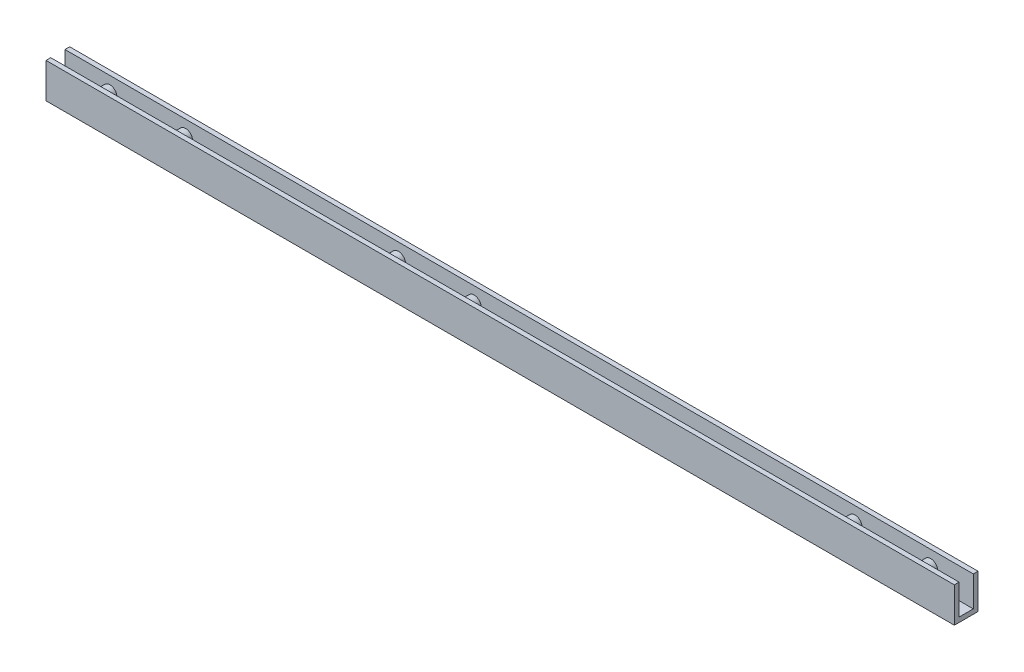
ISO-10303-21;
HEADER;
FILE_DESCRIPTION(('STEP AP214'),'2;1');
FILE_NAME('part.step','',(''),(''),'','','');
FILE_SCHEMA(('AUTOMOTIVE_DESIGN { 1 0 10303 214 1 1 1 1 }'));
ENDSEC;
DATA;
#1=APPLICATION_CONTEXT('core data for automotive mechanical design processes');
#2=APPLICATION_PROTOCOL_DEFINITION('international standard','automotive_design',2000,#1);
#3=PRODUCT_CONTEXT('',#1,'mechanical');
#4=PRODUCT('Part','Part','',(#3));
#5=PRODUCT_RELATED_PRODUCT_CATEGORY('part','',(#4));
#6=PRODUCT_DEFINITION_FORMATION('','',#4);
#7=PRODUCT_DEFINITION_CONTEXT('part definition',#1,'design');
#8=PRODUCT_DEFINITION('design','',#6,#7);
#9=PRODUCT_DEFINITION_SHAPE('','',#8);
#10=(LENGTH_UNIT() NAMED_UNIT(*) SI_UNIT(.MILLI.,.METRE.));
#11=(NAMED_UNIT(*) PLANE_ANGLE_UNIT() SI_UNIT($,.RADIAN.));
#12=(NAMED_UNIT(*) SI_UNIT($,.STERADIAN.) SOLID_ANGLE_UNIT());
#13=UNCERTAINTY_MEASURE_WITH_UNIT(LENGTH_MEASURE(1.E-05),#10,'distance_accuracy_value','');
#14=(GEOMETRIC_REPRESENTATION_CONTEXT(3) GLOBAL_UNCERTAINTY_ASSIGNED_CONTEXT((#13)) GLOBAL_UNIT_ASSIGNED_CONTEXT((#10,
#11,#12)) REPRESENTATION_CONTEXT('',''));
#15=CARTESIAN_POINT('',(0.,0.,0.));
#16=DIRECTION('',(0.,0.,1.));
#17=DIRECTION('',(1.,0.,0.));
#18=AXIS2_PLACEMENT_3D('',#15,#16,#17);
#19=CARTESIAN_POINT('',(609.6,-11.7475,7.9375));
#20=DIRECTION('',(0.,0.,-1.));
#21=DIRECTION('',(0.,1.,0.));
#22=AXIS2_PLACEMENT_3D('',#19,#20,#21);
#23=PLANE('',#22);
#24=DIRECTION('',(0.,-1.,0.));
#25=VECTOR('',#24,1.);
#26=CARTESIAN_POINT('',(0.,-11.7475,7.9375));
#27=LINE('',#26,#25);
#28=CARTESIAN_POINT('',(0.,11.7475,7.9375));
#29=VERTEX_POINT('',#28);
#30=CARTESIAN_POINT('',(0.,-11.7475,7.9375));
#31=VERTEX_POINT('',#30);
#32=EDGE_CURVE('E130',#29,#31,#27,.T.);
#33=ORIENTED_EDGE('',*,*,#32,.T.);
#34=DIRECTION('',(-1.,0.,0.));
#35=VECTOR('',#34,1.);
#36=CARTESIAN_POINT('',(609.6,-11.7475,7.9375));
#37=LINE('',#36,#35);
#38=CARTESIAN_POINT('',(609.6,-11.7475,7.9375));
#39=VERTEX_POINT('',#38);
#40=EDGE_CURVE('E11',#39,#31,#37,.T.);
#41=ORIENTED_EDGE('',*,*,#40,.F.);
#42=DIRECTION('',(0.,-1.,0.));
#43=VECTOR('',#42,1.);
#44=CARTESIAN_POINT('',(609.6,-11.7475,7.9375));
#45=LINE('',#44,#43);
#46=CARTESIAN_POINT('',(609.6,11.7475,7.9375));
#47=VERTEX_POINT('',#46);
#48=EDGE_CURVE('E146',#47,#39,#45,.T.);
#49=ORIENTED_EDGE('',*,*,#48,.F.);
#50=DIRECTION('',(-1.,0.,0.));
#51=VECTOR('',#50,1.);
#52=CARTESIAN_POINT('',(609.6,11.7475,7.9375));
#53=LINE('',#52,#51);
#54=EDGE_CURVE('E126',#47,#29,#53,.T.);
#55=ORIENTED_EDGE('',*,*,#54,.T.);
#56=EDGE_LOOP('',(#33,#41,#49,#55));
#57=FACE_BOUND('',#56,.T.);
#58=ADVANCED_FACE('F34',(#57),#23,.F.);
#59=CARTESIAN_POINT('',(609.6,-11.7475,-7.9375));
#60=DIRECTION('',(0.,1.,0.));
#61=DIRECTION('',(0.,0.,1.));
#62=AXIS2_PLACEMENT_3D('',#59,#60,#61);
#63=PLANE('',#62);
#64=DIRECTION('',(0.,0.,-1.));
#65=VECTOR('',#64,1.);
#66=CARTESIAN_POINT('',(0.,-11.7475,-7.9375));
#67=LINE('',#66,#65);
#68=CARTESIAN_POINT('',(0.,-11.7475,-7.9375));
#69=VERTEX_POINT('',#68);
#70=EDGE_CURVE('E133',#31,#69,#67,.T.);
#71=ORIENTED_EDGE('',*,*,#70,.T.);
#72=DIRECTION('',(-1.,0.,0.));
#73=VECTOR('',#72,1.);
#74=CARTESIAN_POINT('',(609.6,-11.7475,-7.9375));
#75=LINE('',#74,#73);
#76=CARTESIAN_POINT('',(609.6,-11.7475,-7.9375));
#77=VERTEX_POINT('',#76);
#78=EDGE_CURVE('E42',#77,#69,#75,.T.);
#79=ORIENTED_EDGE('',*,*,#78,.F.);
#80=DIRECTION('',(0.,0.,-1.));
#81=VECTOR('',#80,1.);
#82=CARTESIAN_POINT('',(609.6,-11.7475,-7.9375));
#83=LINE('',#82,#81);
#84=EDGE_CURVE('E92',#39,#77,#83,.T.);
#85=ORIENTED_EDGE('',*,*,#84,.F.);
#86=ORIENTED_EDGE('',*,*,#40,.T.);
#87=EDGE_LOOP('',(#71,#79,#85,#86));
#88=FACE_BOUND('',#87,.T.);
#89=ADVANCED_FACE('F252',(#88),#63,.F.);
#90=CARTESIAN_POINT('',(609.6,-11.7475,-7.9375));
#91=DIRECTION('',(0.,0.,1.));
#92=DIRECTION('',(1.,0.,0.));
#93=AXIS2_PLACEMENT_3D('',#90,#91,#92);
#94=PLANE('',#93);
#95=DIRECTION('',(0.,1.,0.));
#96=VECTOR('',#95,1.);
#97=CARTESIAN_POINT('',(0.,-11.7475,-7.9375));
#98=LINE('',#97,#96);
#99=CARTESIAN_POINT('',(0.,11.7475,-7.9375));
#100=VERTEX_POINT('',#99);
#101=EDGE_CURVE('E136',#69,#100,#98,.T.);
#102=ORIENTED_EDGE('',*,*,#101,.T.);
#103=DIRECTION('',(-1.,0.,0.));
#104=VECTOR('',#103,1.);
#105=CARTESIAN_POINT('',(609.6,11.7475,-7.9375));
#106=LINE('',#105,#104);
#107=CARTESIAN_POINT('',(609.6,11.7475,-7.9375));
#108=VERTEX_POINT('',#107);
#109=EDGE_CURVE('E153',#108,#100,#106,.T.);
#110=ORIENTED_EDGE('',*,*,#109,.F.);
#111=DIRECTION('',(0.,1.,0.));
#112=VECTOR('',#111,1.);
#113=CARTESIAN_POINT('',(609.6,-11.7475,-7.9375));
#114=LINE('',#113,#112);
#115=EDGE_CURVE('E161',#77,#108,#114,.T.);
#116=ORIENTED_EDGE('',*,*,#115,.F.);
#117=ORIENTED_EDGE('',*,*,#78,.T.);
#118=EDGE_LOOP('',(#102,#110,#116,#117));
#119=FACE_BOUND('',#118,.T.);
#120=ADVANCED_FACE('F159',(#119),#94,.F.);
#121=CARTESIAN_POINT('',(609.6,11.7475,-4.7625));
#122=DIRECTION('',(0.,-1.,0.));
#123=DIRECTION('',(0.,0.,-1.));
#124=AXIS2_PLACEMENT_3D('',#121,#122,#123);
#125=PLANE('',#124);
#126=DIRECTION('',(0.,0.,1.));
#127=VECTOR('',#126,1.);
#128=CARTESIAN_POINT('',(0.,11.7475,-4.7625));
#129=LINE('',#128,#127);
#130=CARTESIAN_POINT('',(0.,11.7475,-4.7625));
#131=VERTEX_POINT('',#130);
#132=EDGE_CURVE('E138',#100,#131,#129,.T.);
#133=ORIENTED_EDGE('',*,*,#132,.T.);
#134=DIRECTION('',(-1.,0.,0.));
#135=VECTOR('',#134,1.);
#136=CARTESIAN_POINT('',(609.6,11.7475,-4.7625));
#137=LINE('',#136,#135);
#138=CARTESIAN_POINT('',(609.6,11.7475,-4.7625));
#139=VERTEX_POINT('',#138);
#140=EDGE_CURVE('E150',#139,#131,#137,.T.);
#141=ORIENTED_EDGE('',*,*,#140,.F.);
#142=DIRECTION('',(0.,0.,1.));
#143=VECTOR('',#142,1.);
#144=CARTESIAN_POINT('',(609.6,11.7475,-4.7625));
#145=LINE('',#144,#143);
#146=EDGE_CURVE('E172',#108,#139,#145,.T.);
#147=ORIENTED_EDGE('',*,*,#146,.F.);
#148=ORIENTED_EDGE('',*,*,#109,.T.);
#149=EDGE_LOOP('',(#133,#141,#147,#148));
#150=FACE_BOUND('',#149,.T.);
#151=ADVANCED_FACE('F168',(#150),#125,.F.);
#152=CARTESIAN_POINT('',(609.6,-8.5725,-4.7625));
#153=DIRECTION('',(0.,0.,-1.));
#154=DIRECTION('',(-1.,0.,0.));
#155=AXIS2_PLACEMENT_3D('',#152,#153,#154);
#156=PLANE('',#155);
#157=CARTESIAN_POINT('',(80.9625,1.5875,-4.7625));
#158=DIRECTION('',(0.,0.,-1.));
#159=DIRECTION('',(-1.,0.,0.));
#160=AXIS2_PLACEMENT_3D('',#157,#158,#159);
#161=CIRCLE('',#160,4.7625);
#162=CARTESIAN_POINT('',(76.2,1.5875,-4.7625));
#163=VERTEX_POINT('',#162);
#164=EDGE_CURVE('E207',#163,#163,#161,.F.);
#165=ORIENTED_EDGE('',*,*,#164,.F.);
#166=EDGE_LOOP('',(#165));
#167=FACE_BOUND('',#166,.T.);
#168=CARTESIAN_POINT('',(30.1625,1.5875,-4.7625));
#169=DIRECTION('',(0.,0.,-1.));
#170=DIRECTION('',(-1.,0.,0.));
#171=AXIS2_PLACEMENT_3D('',#168,#169,#170);
#172=CIRCLE('',#171,4.76250000000001);
#173=CARTESIAN_POINT('',(25.4,1.5875,-4.7625));
#174=VERTEX_POINT('',#173);
#175=EDGE_CURVE('E201',#174,#174,#172,.F.);
#176=ORIENTED_EDGE('',*,*,#175,.F.);
#177=EDGE_LOOP('',(#176));
#178=FACE_BOUND('',#177,.T.);
#179=CARTESIAN_POINT('',(223.8375,1.5875,-4.7625));
#180=DIRECTION('',(0.,0.,-1.));
#181=DIRECTION('',(-1.,0.,0.));
#182=AXIS2_PLACEMENT_3D('',#179,#180,#181);
#183=CIRCLE('',#182,4.76250000000001);
#184=CARTESIAN_POINT('',(219.075,1.5875,-4.7625));
#185=VERTEX_POINT('',#184);
#186=EDGE_CURVE('E195',#185,#185,#183,.F.);
#187=ORIENTED_EDGE('',*,*,#186,.F.);
#188=EDGE_LOOP('',(#187));
#189=FACE_BOUND('',#188,.T.);
#190=CARTESIAN_POINT('',(274.6375,1.5875,-4.7625));
#191=DIRECTION('',(0.,0.,-1.));
#192=DIRECTION('',(-1.,0.,0.));
#193=AXIS2_PLACEMENT_3D('',#190,#191,#192);
#194=CIRCLE('',#193,4.76250000000007);
#195=CARTESIAN_POINT('',(269.875,1.5875,-4.7625));
#196=VERTEX_POINT('',#195);
#197=EDGE_CURVE('E189',#196,#196,#194,.F.);
#198=ORIENTED_EDGE('',*,*,#197,.F.);
#199=EDGE_LOOP('',(#198));
#200=FACE_BOUND('',#199,.T.);
#201=CARTESIAN_POINT('',(530.225,1.5875,-4.7625));
#202=DIRECTION('',(0.,0.,-1.));
#203=DIRECTION('',(-1.,0.,0.));
#204=AXIS2_PLACEMENT_3D('',#201,#202,#203);
#205=CIRCLE('',#204,4.76250000000001);
#206=CARTESIAN_POINT('',(525.4625,1.5875,-4.7625));
#207=VERTEX_POINT('',#206);
#208=EDGE_CURVE('E183',#207,#207,#205,.F.);
#209=ORIENTED_EDGE('',*,*,#208,.F.);
#210=EDGE_LOOP('',(#209));
#211=FACE_BOUND('',#210,.T.);
#212=CARTESIAN_POINT('',(581.025,1.5875,-4.7625));
#213=DIRECTION('',(0.,0.,-1.));
#214=DIRECTION('',(-1.,0.,0.));
#215=AXIS2_PLACEMENT_3D('',#212,#213,#214);
#216=CIRCLE('',#215,4.76250000000001);
#217=CARTESIAN_POINT('',(576.2625,1.5875,-4.7625));
#218=VERTEX_POINT('',#217);
#219=EDGE_CURVE('E134',#218,#218,#216,.F.);
#220=ORIENTED_EDGE('',*,*,#219,.F.);
#221=EDGE_LOOP('',(#220));
#222=FACE_BOUND('',#221,.T.);
#223=DIRECTION('',(0.,-1.,0.));
#224=VECTOR('',#223,1.);
#225=CARTESIAN_POINT('',(0.,-8.5725,-4.7625));
#226=LINE('',#225,#224);
#227=CARTESIAN_POINT('',(0.,-8.5725,-4.7625));
#228=VERTEX_POINT('',#227);
#229=EDGE_CURVE('E141',#131,#228,#226,.T.);
#230=ORIENTED_EDGE('',*,*,#229,.T.);
#231=DIRECTION('',(-1.,0.,0.));
#232=VECTOR('',#231,1.);
#233=CARTESIAN_POINT('',(609.6,-8.5725,-4.7625));
#234=LINE('',#233,#232);
#235=CARTESIAN_POINT('',(609.6,-8.5725,-4.7625));
#236=VERTEX_POINT('',#235);
#237=EDGE_CURVE('E121',#236,#228,#234,.T.);
#238=ORIENTED_EDGE('',*,*,#237,.F.);
#239=DIRECTION('',(0.,-1.,0.));
#240=VECTOR('',#239,1.);
#241=CARTESIAN_POINT('',(609.6,8.5725,-4.7625));
#242=LINE('',#241,#240);
#243=EDGE_CURVE('E111',#139,#236,#242,.T.);
#244=ORIENTED_EDGE('',*,*,#243,.F.);
#245=ORIENTED_EDGE('',*,*,#140,.T.);
#246=EDGE_LOOP('',(#230,#238,#244,#245));
#247=FACE_BOUND('',#246,.T.);
#248=ADVANCED_FACE('F171',(#167,#178,#189,#200,#211,#222,#247),#156,.F.);
#249=CARTESIAN_POINT('',(609.6,-8.5725,-4.7625));
#250=DIRECTION('',(0.,-1.,0.));
#251=DIRECTION('',(0.,0.,-1.));
#252=AXIS2_PLACEMENT_3D('',#249,#250,#251);
#253=PLANE('',#252);
#254=DIRECTION('',(0.,0.,1.));
#255=VECTOR('',#254,1.);
#256=CARTESIAN_POINT('',(0.,-8.5725,-4.7625));
#257=LINE('',#256,#255);
#258=CARTESIAN_POINT('',(0.,-8.5725,4.7625));
#259=VERTEX_POINT('',#258);
#260=EDGE_CURVE('E120',#228,#259,#257,.T.);
#261=ORIENTED_EDGE('',*,*,#260,.T.);
#262=DIRECTION('',(-1.,0.,0.));
#263=VECTOR('',#262,1.);
#264=CARTESIAN_POINT('',(609.6,-8.5725,4.7625));
#265=LINE('',#264,#263);
#266=CARTESIAN_POINT('',(609.6,-8.5725,4.7625));
#267=VERTEX_POINT('',#266);
#268=EDGE_CURVE('E117',#267,#259,#265,.T.);
#269=ORIENTED_EDGE('',*,*,#268,.F.);
#270=DIRECTION('',(0.,0.,1.));
#271=VECTOR('',#270,1.);
#272=CARTESIAN_POINT('',(609.6,-8.5725,-4.7625));
#273=LINE('',#272,#271);
#274=EDGE_CURVE('E105',#236,#267,#273,.T.);
#275=ORIENTED_EDGE('',*,*,#274,.F.);
#276=ORIENTED_EDGE('',*,*,#237,.T.);
#277=EDGE_LOOP('',(#261,#269,#275,#276));
#278=FACE_BOUND('',#277,.T.);
#279=ADVANCED_FACE('F118',(#278),#253,.F.);
#280=CARTESIAN_POINT('',(609.6,7.04849999999999,4.7625));
#281=DIRECTION('',(0.,0.,1.));
#282=DIRECTION('',(1.,0.,0.));
#283=AXIS2_PLACEMENT_3D('',#280,#281,#282);
#284=PLANE('',#283);
#285=CARTESIAN_POINT('',(80.9625,1.5875,4.7625));
#286=DIRECTION('',(0.,0.,1.));
#287=DIRECTION('',(1.,0.,0.));
#288=AXIS2_PLACEMENT_3D('',#285,#286,#287);
#289=CIRCLE('',#288,4.7625);
#290=CARTESIAN_POINT('',(85.725,1.5875,4.7625));
#291=VERTEX_POINT('',#290);
#292=EDGE_CURVE('E210',#291,#291,#289,.T.);
#293=ORIENTED_EDGE('',*,*,#292,.T.);
#294=EDGE_LOOP('',(#293));
#295=FACE_BOUND('',#294,.T.);
#296=CARTESIAN_POINT('',(30.1625,1.5875,4.7625));
#297=DIRECTION('',(0.,0.,1.));
#298=DIRECTION('',(1.,0.,0.));
#299=AXIS2_PLACEMENT_3D('',#296,#297,#298);
#300=CIRCLE('',#299,4.76250000000001);
#301=CARTESIAN_POINT('',(34.925,1.5875,4.7625));
#302=VERTEX_POINT('',#301);
#303=EDGE_CURVE('E204',#302,#302,#300,.T.);
#304=ORIENTED_EDGE('',*,*,#303,.T.);
#305=EDGE_LOOP('',(#304));
#306=FACE_BOUND('',#305,.T.);
#307=CARTESIAN_POINT('',(223.8375,1.5875,4.7625));
#308=DIRECTION('',(0.,0.,1.));
#309=DIRECTION('',(1.,0.,0.));
#310=AXIS2_PLACEMENT_3D('',#307,#308,#309);
#311=CIRCLE('',#310,4.76250000000001);
#312=CARTESIAN_POINT('',(228.6,1.5875,4.7625));
#313=VERTEX_POINT('',#312);
#314=EDGE_CURVE('E198',#313,#313,#311,.T.);
#315=ORIENTED_EDGE('',*,*,#314,.T.);
#316=EDGE_LOOP('',(#315));
#317=FACE_BOUND('',#316,.T.);
#318=CARTESIAN_POINT('',(274.6375,1.5875,4.7625));
#319=DIRECTION('',(0.,0.,1.));
#320=DIRECTION('',(1.,0.,0.));
#321=AXIS2_PLACEMENT_3D('',#318,#319,#320);
#322=CIRCLE('',#321,4.76250000000007);
#323=CARTESIAN_POINT('',(279.4,1.5875,4.7625));
#324=VERTEX_POINT('',#323);
#325=EDGE_CURVE('E192',#324,#324,#322,.T.);
#326=ORIENTED_EDGE('',*,*,#325,.T.);
#327=EDGE_LOOP('',(#326));
#328=FACE_BOUND('',#327,.T.);
#329=CARTESIAN_POINT('',(530.225,1.5875,4.7625));
#330=DIRECTION('',(0.,0.,1.));
#331=DIRECTION('',(1.,0.,0.));
#332=AXIS2_PLACEMENT_3D('',#329,#330,#331);
#333=CIRCLE('',#332,4.76250000000001);
#334=CARTESIAN_POINT('',(534.9875,1.5875,4.7625));
#335=VERTEX_POINT('',#334);
#336=EDGE_CURVE('E186',#335,#335,#333,.T.);
#337=ORIENTED_EDGE('',*,*,#336,.T.);
#338=EDGE_LOOP('',(#337));
#339=FACE_BOUND('',#338,.T.);
#340=CARTESIAN_POINT('',(581.025,1.5875,4.7625));
#341=DIRECTION('',(0.,0.,1.));
#342=DIRECTION('',(1.,0.,0.));
#343=AXIS2_PLACEMENT_3D('',#340,#341,#342);
#344=CIRCLE('',#343,4.76250000000001);
#345=CARTESIAN_POINT('',(585.7875,1.5875,4.7625));
#346=VERTEX_POINT('',#345);
#347=EDGE_CURVE('E180',#346,#346,#344,.T.);
#348=ORIENTED_EDGE('',*,*,#347,.T.);
#349=EDGE_LOOP('',(#348));
#350=FACE_BOUND('',#349,.T.);
#351=DIRECTION('',(0.,1.,0.));
#352=VECTOR('',#351,1.);
#353=CARTESIAN_POINT('',(0.,7.04849999999999,4.7625));
#354=LINE('',#353,#352);
#355=CARTESIAN_POINT('',(0.,11.7475,4.7625));
#356=VERTEX_POINT('',#355);
#357=EDGE_CURVE('E78',#259,#356,#354,.T.);
#358=ORIENTED_EDGE('',*,*,#357,.T.);
#359=DIRECTION('',(-1.,0.,0.));
#360=VECTOR('',#359,1.);
#361=CARTESIAN_POINT('',(609.6,11.7475,4.7625));
#362=LINE('',#361,#360);
#363=CARTESIAN_POINT('',(609.6,11.7475,4.7625));
#364=VERTEX_POINT('',#363);
#365=EDGE_CURVE('E122',#364,#356,#362,.T.);
#366=ORIENTED_EDGE('',*,*,#365,.F.);
#367=DIRECTION('',(0.,1.,0.));
#368=VECTOR('',#367,1.);
#369=CARTESIAN_POINT('',(609.6,-8.5725,4.7625));
#370=LINE('',#369,#368);
#371=EDGE_CURVE('E109',#267,#364,#370,.T.);
#372=ORIENTED_EDGE('',*,*,#371,.F.);
#373=ORIENTED_EDGE('',*,*,#268,.T.);
#374=EDGE_LOOP('',(#358,#366,#372,#373));
#375=FACE_BOUND('',#374,.T.);
#376=ADVANCED_FACE('F124',(#295,#306,#317,#328,#339,#350,#375),#284,.F.);
#377=CARTESIAN_POINT('',(609.6,11.7475,4.7625));
#378=DIRECTION('',(0.,-1.,0.));
#379=DIRECTION('',(0.,0.,-1.));
#380=AXIS2_PLACEMENT_3D('',#377,#378,#379);
#381=PLANE('',#380);
#382=DIRECTION('',(0.,0.,1.));
#383=VECTOR('',#382,1.);
#384=CARTESIAN_POINT('',(0.,11.7475,4.7625));
#385=LINE('',#384,#383);
#386=EDGE_CURVE('E84',#356,#29,#385,.T.);
#387=ORIENTED_EDGE('',*,*,#386,.T.);
#388=ORIENTED_EDGE('',*,*,#54,.F.);
#389=DIRECTION('',(0.,0.,1.));
#390=VECTOR('',#389,1.);
#391=CARTESIAN_POINT('',(609.6,11.7475,4.7625));
#392=LINE('',#391,#390);
#393=EDGE_CURVE('E50',#364,#47,#392,.T.);
#394=ORIENTED_EDGE('',*,*,#393,.F.);
#395=ORIENTED_EDGE('',*,*,#365,.T.);
#396=EDGE_LOOP('',(#387,#388,#394,#395));
#397=FACE_BOUND('',#396,.T.);
#398=ADVANCED_FACE('F259',(#397),#381,.F.);
#399=CARTESIAN_POINT('',(609.6,0.,0.));
#400=DIRECTION('',(1.,0.,0.));
#401=DIRECTION('',(0.,0.,-1.));
#402=AXIS2_PLACEMENT_3D('',#399,#400,#401);
#403=PLANE('',#402);
#404=ORIENTED_EDGE('',*,*,#48,.T.);
#405=ORIENTED_EDGE('',*,*,#84,.T.);
#406=ORIENTED_EDGE('',*,*,#115,.T.);
#407=ORIENTED_EDGE('',*,*,#146,.T.);
#408=ORIENTED_EDGE('',*,*,#243,.T.);
#409=ORIENTED_EDGE('',*,*,#274,.T.);
#410=ORIENTED_EDGE('',*,*,#371,.T.);
#411=ORIENTED_EDGE('',*,*,#393,.T.);
#412=EDGE_LOOP('',(#404,#405,#406,#407,#408,#409,#410,#411));
#413=FACE_BOUND('',#412,.T.);
#414=ADVANCED_FACE('F107',(#413),#403,.T.);
#415=CARTESIAN_POINT('',(0.,0.,0.));
#416=DIRECTION('',(1.,0.,0.));
#417=DIRECTION('',(0.,0.,-1.));
#418=AXIS2_PLACEMENT_3D('',#415,#416,#417);
#419=PLANE('',#418);
#420=ORIENTED_EDGE('',*,*,#32,.F.);
#421=ORIENTED_EDGE('',*,*,#386,.F.);
#422=ORIENTED_EDGE('',*,*,#357,.F.);
#423=ORIENTED_EDGE('',*,*,#260,.F.);
#424=ORIENTED_EDGE('',*,*,#229,.F.);
#425=ORIENTED_EDGE('',*,*,#132,.F.);
#426=ORIENTED_EDGE('',*,*,#101,.F.);
#427=ORIENTED_EDGE('',*,*,#70,.F.);
#428=EDGE_LOOP('',(#420,#421,#422,#423,#424,#425,#426,#427));
#429=FACE_BOUND('',#428,.T.);
#430=ADVANCED_FACE('F165',(#429),#419,.F.);
#431=CARTESIAN_POINT('',(581.025,1.5875,-18.2328841816039));
#432=DIRECTION('',(0.,0.,1.));
#433=DIRECTION('',(1.,0.,0.));
#434=AXIS2_PLACEMENT_3D('',#431,#432,#433);
#435=CYLINDRICAL_SURFACE('',#434,4.76250000000001);
#436=ORIENTED_EDGE('',*,*,#347,.F.);
#437=EDGE_LOOP('',(#436));
#438=FACE_BOUND('',#437,.T.);
#439=ORIENTED_EDGE('',*,*,#219,.T.);
#440=EDGE_LOOP('',(#439));
#441=FACE_BOUND('',#440,.T.);
#442=ADVANCED_FACE('F236',(#438,#441),#435,.T.);
#443=CARTESIAN_POINT('',(530.225,1.5875,-18.2328841816039));
#444=DIRECTION('',(0.,0.,1.));
#445=DIRECTION('',(1.,0.,0.));
#446=AXIS2_PLACEMENT_3D('',#443,#444,#445);
#447=CYLINDRICAL_SURFACE('',#446,4.76250000000001);
#448=ORIENTED_EDGE('',*,*,#336,.F.);
#449=EDGE_LOOP('',(#448));
#450=FACE_BOUND('',#449,.T.);
#451=ORIENTED_EDGE('',*,*,#208,.T.);
#452=EDGE_LOOP('',(#451));
#453=FACE_BOUND('',#452,.T.);
#454=ADVANCED_FACE('F238',(#450,#453),#447,.T.);
#455=CARTESIAN_POINT('',(274.6375,1.5875,-18.2328841816039));
#456=DIRECTION('',(0.,0.,1.));
#457=DIRECTION('',(1.,0.,0.));
#458=AXIS2_PLACEMENT_3D('',#455,#456,#457);
#459=CYLINDRICAL_SURFACE('',#458,4.76250000000007);
#460=ORIENTED_EDGE('',*,*,#325,.F.);
#461=EDGE_LOOP('',(#460));
#462=FACE_BOUND('',#461,.T.);
#463=ORIENTED_EDGE('',*,*,#197,.T.);
#464=EDGE_LOOP('',(#463));
#465=FACE_BOUND('',#464,.T.);
#466=ADVANCED_FACE('F245',(#462,#465),#459,.T.);
#467=CARTESIAN_POINT('',(223.8375,1.5875,-18.2328841816039));
#468=DIRECTION('',(0.,0.,1.));
#469=DIRECTION('',(1.,0.,0.));
#470=AXIS2_PLACEMENT_3D('',#467,#468,#469);
#471=CYLINDRICAL_SURFACE('',#470,4.76250000000001);
#472=ORIENTED_EDGE('',*,*,#314,.F.);
#473=EDGE_LOOP('',(#472));
#474=FACE_BOUND('',#473,.T.);
#475=ORIENTED_EDGE('',*,*,#186,.T.);
#476=EDGE_LOOP('',(#475));
#477=FACE_BOUND('',#476,.T.);
#478=ADVANCED_FACE('F316',(#474,#477),#471,.T.);
#479=CARTESIAN_POINT('',(30.1625,1.5875,-18.2328841816039));
#480=DIRECTION('',(0.,0.,1.));
#481=DIRECTION('',(1.,0.,0.));
#482=AXIS2_PLACEMENT_3D('',#479,#480,#481);
#483=CYLINDRICAL_SURFACE('',#482,4.76250000000001);
#484=ORIENTED_EDGE('',*,*,#303,.F.);
#485=EDGE_LOOP('',(#484));
#486=FACE_BOUND('',#485,.T.);
#487=ORIENTED_EDGE('',*,*,#175,.T.);
#488=EDGE_LOOP('',(#487));
#489=FACE_BOUND('',#488,.T.);
#490=ADVANCED_FACE('F219',(#486,#489),#483,.T.);
#491=CARTESIAN_POINT('',(80.9625,1.5875,-18.2328841816039));
#492=DIRECTION('',(0.,0.,1.));
#493=DIRECTION('',(1.,0.,0.));
#494=AXIS2_PLACEMENT_3D('',#491,#492,#493);
#495=CYLINDRICAL_SURFACE('',#494,4.7625);
#496=ORIENTED_EDGE('',*,*,#292,.F.);
#497=EDGE_LOOP('',(#496));
#498=FACE_BOUND('',#497,.T.);
#499=ORIENTED_EDGE('',*,*,#164,.T.);
#500=EDGE_LOOP('',(#499));
#501=FACE_BOUND('',#500,.T.);
#502=ADVANCED_FACE('F216',(#498,#501),#495,.T.);
#503=CLOSED_SHELL('',(#58,#89,#120,#151,#248,#279,#376,#398,#414,#430,#442,#454,#466,#478,#490,#502));
#504=MANIFOLD_SOLID_BREP('B2',#503);
#505=ADVANCED_BREP_SHAPE_REPRESENTATION('',(#18,#504),#14);
#506=SHAPE_DEFINITION_REPRESENTATION(#9,#505);
ENDSEC;
END-ISO-10303-21;
